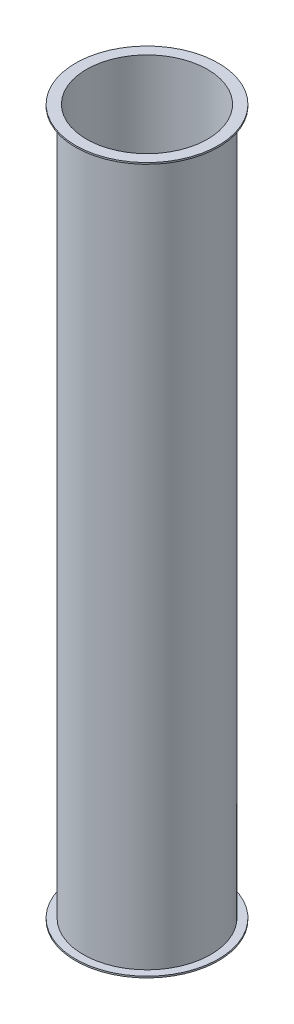
ISO-10303-21;
HEADER;
FILE_DESCRIPTION(('STEP AP214'),'2;1');
FILE_NAME('part.step','',(''),(''),'','','');
FILE_SCHEMA(('AUTOMOTIVE_DESIGN { 1 0 10303 214 1 1 1 1 }'));
ENDSEC;
DATA;
#1=APPLICATION_CONTEXT('core data for automotive mechanical design processes');
#2=APPLICATION_PROTOCOL_DEFINITION('international standard','automotive_design',2000,#1);
#3=PRODUCT_CONTEXT('',#1,'mechanical');
#4=PRODUCT('Part','Part','',(#3));
#5=PRODUCT_RELATED_PRODUCT_CATEGORY('part','',(#4));
#6=PRODUCT_DEFINITION_FORMATION('','',#4);
#7=PRODUCT_DEFINITION_CONTEXT('part definition',#1,'design');
#8=PRODUCT_DEFINITION('design','',#6,#7);
#9=PRODUCT_DEFINITION_SHAPE('','',#8);
#10=(LENGTH_UNIT() NAMED_UNIT(*) SI_UNIT(.MILLI.,.METRE.));
#11=(NAMED_UNIT(*) PLANE_ANGLE_UNIT() SI_UNIT($,.RADIAN.));
#12=(NAMED_UNIT(*) SI_UNIT($,.STERADIAN.) SOLID_ANGLE_UNIT());
#13=UNCERTAINTY_MEASURE_WITH_UNIT(LENGTH_MEASURE(1.E-05),#10,'distance_accuracy_value','');
#14=(GEOMETRIC_REPRESENTATION_CONTEXT(3) GLOBAL_UNCERTAINTY_ASSIGNED_CONTEXT((#13)) GLOBAL_UNIT_ASSIGNED_CONTEXT((#10,
#11,#12)) REPRESENTATION_CONTEXT('',''));
#15=CARTESIAN_POINT('',(0.,0.,0.));
#16=DIRECTION('',(0.,0.,1.));
#17=DIRECTION('',(1.,0.,0.));
#18=AXIS2_PLACEMENT_3D('',#15,#16,#17);
#19=CARTESIAN_POINT('',(0.,227.5,0.));
#20=DIRECTION('',(0.,-1.,0.));
#21=DIRECTION('',(0.,0.,-1.));
#22=AXIS2_PLACEMENT_3D('',#19,#20,#21);
#23=CYLINDRICAL_SURFACE('',#22,41.);
#24=CARTESIAN_POINT('',(0.,226.5,0.));
#25=DIRECTION('',(0.,1.,0.));
#26=DIRECTION('',(0.,0.,1.));
#27=AXIS2_PLACEMENT_3D('',#24,#25,#26);
#28=CIRCLE('',#27,41.);
#29=CARTESIAN_POINT('',(0.,226.5,-41.));
#30=VERTEX_POINT('',#29);
#31=EDGE_CURVE('E47',#30,#30,#28,.T.);
#32=CARTESIAN_POINT('',(0.,-226.5,0.));
#33=DIRECTION('',(0.,-1.,0.));
#34=DIRECTION('',(0.,0.,-1.));
#35=AXIS2_PLACEMENT_3D('',#32,#33,#34);
#36=CIRCLE('',#35,41.);
#37=CARTESIAN_POINT('',(0.,-226.5,-41.));
#38=VERTEX_POINT('',#37);
#39=EDGE_CURVE('E11',#38,#38,#36,.T.);
#40=CARTESIAN_POINT('',(0.,226.5,-41.));
#41=CARTESIAN_POINT('',(0.,221.78125,-41.));
#42=CARTESIAN_POINT('',(0.,217.0625,-41.));
#43=CARTESIAN_POINT('',(0.,207.625,-41.));
#44=CARTESIAN_POINT('',(0.,202.90625,-41.));
#45=CARTESIAN_POINT('',(0.,193.46875,-41.));
#46=CARTESIAN_POINT('',(0.,188.75,-41.));
#47=CARTESIAN_POINT('',(0.,179.3125,-41.));
#48=CARTESIAN_POINT('',(0.,174.59375,-41.));
#49=CARTESIAN_POINT('',(0.,165.15625,-41.));
#50=CARTESIAN_POINT('',(0.,160.4375,-41.));
#51=CARTESIAN_POINT('',(0.,151.,-41.));
#52=CARTESIAN_POINT('',(0.,146.28125,-41.));
#53=CARTESIAN_POINT('',(0.,136.84375,-41.));
#54=CARTESIAN_POINT('',(0.,132.125,-41.));
#55=CARTESIAN_POINT('',(0.,122.6875,-41.));
#56=CARTESIAN_POINT('',(0.,117.96875,-41.));
#57=CARTESIAN_POINT('',(0.,108.53125,-41.));
#58=CARTESIAN_POINT('',(0.,103.8125,-41.));
#59=CARTESIAN_POINT('',(0.,94.375,-41.));
#60=CARTESIAN_POINT('',(0.,89.65625,-41.));
#61=CARTESIAN_POINT('',(0.,80.21875,-41.));
#62=CARTESIAN_POINT('',(0.,75.5,-41.));
#63=CARTESIAN_POINT('',(0.,66.0625,-41.));
#64=CARTESIAN_POINT('',(0.,61.34375,-41.));
#65=CARTESIAN_POINT('',(0.,51.90625,-41.));
#66=CARTESIAN_POINT('',(0.,47.1875,-41.));
#67=CARTESIAN_POINT('',(0.,37.75,-41.));
#68=CARTESIAN_POINT('',(0.,33.03125,-41.));
#69=CARTESIAN_POINT('',(0.,23.59375,-41.));
#70=CARTESIAN_POINT('',(0.,18.875,-41.));
#71=CARTESIAN_POINT('',(0.,9.43749999999999,-41.));
#72=CARTESIAN_POINT('',(0.,4.71874999999999,-41.));
#73=CARTESIAN_POINT('',(0.,-4.71875000000001,-41.));
#74=CARTESIAN_POINT('',(0.,-9.43750000000002,-41.));
#75=CARTESIAN_POINT('',(0.,-18.875,-41.));
#76=CARTESIAN_POINT('',(0.,-23.59375,-41.));
#77=CARTESIAN_POINT('',(0.,-33.03125,-41.));
#78=CARTESIAN_POINT('',(0.,-37.75,-41.));
#79=CARTESIAN_POINT('',(0.,-47.1875,-41.));
#80=CARTESIAN_POINT('',(0.,-51.90625,-41.));
#81=CARTESIAN_POINT('',(0.,-61.34375,-41.));
#82=CARTESIAN_POINT('',(0.,-66.0625,-41.));
#83=CARTESIAN_POINT('',(0.,-75.5,-41.));
#84=CARTESIAN_POINT('',(0.,-80.21875,-41.));
#85=CARTESIAN_POINT('',(0.,-89.65625,-41.));
#86=CARTESIAN_POINT('',(0.,-94.375,-41.));
#87=CARTESIAN_POINT('',(0.,-103.8125,-41.));
#88=CARTESIAN_POINT('',(0.,-108.53125,-41.));
#89=CARTESIAN_POINT('',(0.,-117.96875,-41.));
#90=CARTESIAN_POINT('',(0.,-122.6875,-41.));
#91=CARTESIAN_POINT('',(0.,-132.125,-41.));
#92=CARTESIAN_POINT('',(0.,-136.84375,-41.));
#93=CARTESIAN_POINT('',(0.,-146.28125,-41.));
#94=CARTESIAN_POINT('',(0.,-151.,-41.));
#95=CARTESIAN_POINT('',(0.,-160.4375,-41.));
#96=CARTESIAN_POINT('',(0.,-165.15625,-41.));
#97=CARTESIAN_POINT('',(0.,-174.59375,-41.));
#98=CARTESIAN_POINT('',(0.,-179.3125,-41.));
#99=CARTESIAN_POINT('',(0.,-188.75,-41.));
#100=CARTESIAN_POINT('',(0.,-193.46875,-41.));
#101=CARTESIAN_POINT('',(0.,-202.90625,-41.));
#102=CARTESIAN_POINT('',(0.,-207.625,-41.));
#103=CARTESIAN_POINT('',(0.,-217.0625,-41.));
#104=CARTESIAN_POINT('',(0.,-221.78125,-41.));
#105=CARTESIAN_POINT('',(0.,-226.5,-41.));
#106=B_SPLINE_CURVE_WITH_KNOTS('',3,(#40,#41,#42,#43,#44,#45,#46,#47,#48,#49,#50,#51,#52,#53,
#54,#55,#56,#57,#58,#59,#60,#61,#62,#63,#64,#65,#66,#67,#68,#69,#70,#71,#72,#73,#74,#75,#76,#77,
#78,#79,#80,#81,#82,#83,#84,#85,#86,#87,#88,#89,#90,#91,#92,#93,#94,#95,#96,#97,#98,#99,#100,
#101,#102,#103,#104,#105),.UNSPECIFIED.,.F.,.F.,(4,2,2,2,2,2,2,2,2,2,2,2,2,2,2,2,2,2,2,2,2,2,2,
2,2,2,2,2,2,2,2,2,4),(0.,14.15625,28.3125,42.46875,56.625,70.78125,84.9375,99.09375,113.25,
127.40625,141.5625,155.71875,169.875,184.03125,198.1875,212.34375,226.5,240.65625,254.8125,
268.96875,283.125,297.28125,311.4375,325.59375,339.75,353.90625,368.0625,382.21875,396.375,
410.53125,424.6875,438.84375,453.),.UNSPECIFIED.);
#107=EDGE_CURVE('BSEAM41',#30,#38,#106,.T.);
#108=ORIENTED_EDGE('',*,*,#31,.F.);
#109=ORIENTED_EDGE('',*,*,#39,.F.);
#110=ORIENTED_EDGE('',*,*,#107,.T.);
#111=ORIENTED_EDGE('',*,*,#107,.F.);
#112=EDGE_LOOP('',(#108,#110,#109,#111));
#113=FACE_BOUND('',#112,.T.);
#114=ADVANCED_FACE('F41',(#113),#23,.T.);
#115=CARTESIAN_POINT('',(0.,227.5,0.));
#116=DIRECTION('',(0.,1.,0.));
#117=DIRECTION('',(0.,0.,1.));
#118=AXIS2_PLACEMENT_3D('',#115,#116,#117);
#119=PLANE('',#118);
#120=CARTESIAN_POINT('',(0.,227.5,0.));
#121=DIRECTION('',(0.,1.,0.));
#122=DIRECTION('',(0.,0.,1.));
#123=AXIS2_PLACEMENT_3D('',#120,#121,#122);
#124=CIRCLE('',#123,39.);
#125=CARTESIAN_POINT('',(0.,227.5,-39.));
#126=VERTEX_POINT('',#125);
#127=EDGE_CURVE('E51',#126,#126,#124,.T.);
#128=ORIENTED_EDGE('',*,*,#127,.F.);
#129=EDGE_LOOP('',(#128));
#130=FACE_BOUND('',#129,.T.);
#131=CARTESIAN_POINT('',(0.,227.5,0.));
#132=DIRECTION('',(0.,1.,0.));
#133=DIRECTION('',(0.,0.,1.));
#134=AXIS2_PLACEMENT_3D('',#131,#132,#133);
#135=CIRCLE('',#134,46.);
#136=CARTESIAN_POINT('',(0.,227.5,46.));
#137=VERTEX_POINT('',#136);
#138=EDGE_CURVE('E61',#137,#137,#135,.T.);
#139=ORIENTED_EDGE('',*,*,#138,.T.);
#140=EDGE_LOOP('',(#139));
#141=FACE_BOUND('',#140,.T.);
#142=ADVANCED_FACE('F85',(#130,#141),#119,.T.);
#143=CARTESIAN_POINT('',(0.,-227.5,0.));
#144=DIRECTION('',(0.,1.,0.));
#145=DIRECTION('',(0.,0.,1.));
#146=AXIS2_PLACEMENT_3D('',#143,#144,#145);
#147=PLANE('',#146);
#148=CARTESIAN_POINT('',(0.,-227.5,0.));
#149=DIRECTION('',(0.,1.,0.));
#150=DIRECTION('',(0.,0.,1.));
#151=AXIS2_PLACEMENT_3D('',#148,#149,#150);
#152=CIRCLE('',#151,39.);
#153=CARTESIAN_POINT('',(0.,-227.5,-39.));
#154=VERTEX_POINT('',#153);
#155=EDGE_CURVE('E55',#154,#154,#152,.T.);
#156=ORIENTED_EDGE('',*,*,#155,.T.);
#157=EDGE_LOOP('',(#156));
#158=FACE_BOUND('',#157,.T.);
#159=CARTESIAN_POINT('',(0.,-227.5,0.));
#160=DIRECTION('',(0.,-1.,0.));
#161=DIRECTION('',(0.,0.,-1.));
#162=AXIS2_PLACEMENT_3D('',#159,#160,#161);
#163=CIRCLE('',#162,46.);
#164=CARTESIAN_POINT('',(0.,-227.5,-46.));
#165=VERTEX_POINT('',#164);
#166=EDGE_CURVE('E67',#165,#165,#163,.T.);
#167=ORIENTED_EDGE('',*,*,#166,.T.);
#168=EDGE_LOOP('',(#167));
#169=FACE_BOUND('',#168,.T.);
#170=ADVANCED_FACE('F90',(#158,#169),#147,.F.);
#171=CARTESIAN_POINT('',(0.,227.5,0.));
#172=DIRECTION('',(0.,-1.,0.));
#173=DIRECTION('',(0.,0.,-1.));
#174=AXIS2_PLACEMENT_3D('',#171,#172,#173);
#175=CYLINDRICAL_SURFACE('',#174,39.);
#176=CARTESIAN_POINT('',(0.,227.5,-39.));
#177=CARTESIAN_POINT('',(0.,222.760416666667,-39.));
#178=CARTESIAN_POINT('',(0.,218.020833333333,-39.));
#179=CARTESIAN_POINT('',(0.,208.541666666667,-39.));
#180=CARTESIAN_POINT('',(0.,203.802083333333,-39.));
#181=CARTESIAN_POINT('',(0.,194.322916666667,-39.));
#182=CARTESIAN_POINT('',(0.,189.583333333333,-39.));
#183=CARTESIAN_POINT('',(0.,180.104166666667,-39.));
#184=CARTESIAN_POINT('',(0.,175.364583333333,-39.));
#185=CARTESIAN_POINT('',(0.,165.885416666667,-39.));
#186=CARTESIAN_POINT('',(0.,161.145833333333,-39.));
#187=CARTESIAN_POINT('',(0.,151.666666666667,-39.));
#188=CARTESIAN_POINT('',(0.,146.927083333333,-39.));
#189=CARTESIAN_POINT('',(0.,137.447916666667,-39.));
#190=CARTESIAN_POINT('',(0.,132.708333333333,-39.));
#191=CARTESIAN_POINT('',(0.,123.229166666667,-39.));
#192=CARTESIAN_POINT('',(0.,118.489583333333,-39.));
#193=CARTESIAN_POINT('',(0.,109.010416666667,-39.));
#194=CARTESIAN_POINT('',(0.,104.270833333333,-39.));
#195=CARTESIAN_POINT('',(0.,94.7916666666667,-39.));
#196=CARTESIAN_POINT('',(0.,90.0520833333334,-39.));
#197=CARTESIAN_POINT('',(0.,80.5729166666667,-39.));
#198=CARTESIAN_POINT('',(0.,75.8333333333333,-39.));
#199=CARTESIAN_POINT('',(0.,66.3541666666667,-39.));
#200=CARTESIAN_POINT('',(0.,61.6145833333333,-39.));
#201=CARTESIAN_POINT('',(0.,52.1354166666667,-39.));
#202=CARTESIAN_POINT('',(0.,47.3958333333333,-39.));
#203=CARTESIAN_POINT('',(0.,37.9166666666667,-39.));
#204=CARTESIAN_POINT('',(0.,33.1770833333333,-39.));
#205=CARTESIAN_POINT('',(0.,23.6979166666667,-39.));
#206=CARTESIAN_POINT('',(0.,18.9583333333333,-39.));
#207=CARTESIAN_POINT('',(0.,9.47916666666667,-39.));
#208=CARTESIAN_POINT('',(0.,4.73958333333333,-39.));
#209=CARTESIAN_POINT('',(0.,-4.73958333333333,-39.));
#210=CARTESIAN_POINT('',(0.,-9.47916666666667,-39.));
#211=CARTESIAN_POINT('',(0.,-18.9583333333333,-39.));
#212=CARTESIAN_POINT('',(0.,-23.6979166666667,-39.));
#213=CARTESIAN_POINT('',(0.,-33.1770833333333,-39.));
#214=CARTESIAN_POINT('',(0.,-37.9166666666667,-39.));
#215=CARTESIAN_POINT('',(0.,-47.3958333333333,-39.));
#216=CARTESIAN_POINT('',(0.,-52.1354166666667,-39.));
#217=CARTESIAN_POINT('',(0.,-61.6145833333333,-39.));
#218=CARTESIAN_POINT('',(0.,-66.3541666666666,-39.));
#219=CARTESIAN_POINT('',(0.,-75.8333333333333,-39.));
#220=CARTESIAN_POINT('',(0.,-80.5729166666666,-39.));
#221=CARTESIAN_POINT('',(0.,-90.0520833333333,-39.));
#222=CARTESIAN_POINT('',(0.,-94.7916666666666,-39.));
#223=CARTESIAN_POINT('',(0.,-104.270833333333,-39.));
#224=CARTESIAN_POINT('',(0.,-109.010416666667,-39.));
#225=CARTESIAN_POINT('',(0.,-118.489583333333,-39.));
#226=CARTESIAN_POINT('',(0.,-123.229166666667,-39.));
#227=CARTESIAN_POINT('',(0.,-132.708333333333,-39.));
#228=CARTESIAN_POINT('',(0.,-137.447916666667,-39.));
#229=CARTESIAN_POINT('',(0.,-146.927083333333,-39.));
#230=CARTESIAN_POINT('',(0.,-151.666666666667,-39.));
#231=CARTESIAN_POINT('',(0.,-161.145833333333,-39.));
#232=CARTESIAN_POINT('',(0.,-165.885416666667,-39.));
#233=CARTESIAN_POINT('',(0.,-175.364583333333,-39.));
#234=CARTESIAN_POINT('',(0.,-180.104166666667,-39.));
#235=CARTESIAN_POINT('',(0.,-189.583333333333,-39.));
#236=CARTESIAN_POINT('',(0.,-194.322916666667,-39.));
#237=CARTESIAN_POINT('',(0.,-203.802083333333,-39.));
#238=CARTESIAN_POINT('',(0.,-208.541666666667,-39.));
#239=CARTESIAN_POINT('',(0.,-218.020833333333,-39.));
#240=CARTESIAN_POINT('',(0.,-222.760416666667,-39.));
#241=CARTESIAN_POINT('',(0.,-227.5,-39.));
#242=B_SPLINE_CURVE_WITH_KNOTS('',3,(#176,#177,#178,#179,#180,#181,#182,#183,#184,#185,#186,
#187,#188,#189,#190,#191,#192,#193,#194,#195,#196,#197,#198,#199,#200,#201,#202,#203,#204,#205,
#206,#207,#208,#209,#210,#211,#212,#213,#214,#215,#216,#217,#218,#219,#220,#221,#222,#223,#224,
#225,#226,#227,#228,#229,#230,#231,#232,#233,#234,#235,#236,#237,#238,#239,#240,#241),
.UNSPECIFIED.,.F.,.F.,(4,2,2,2,2,2,2,2,2,2,2,2,2,2,2,2,2,2,2,2,2,2,2,2,2,2,2,2,2,2,2,2,4),(0.,
14.21875,28.4375,42.65625,56.875,71.09375,85.3125,99.53125,113.75,127.96875,142.1875,156.40625,
170.625,184.84375,199.0625,213.28125,227.5,241.71875,255.9375,270.15625,284.375,298.59375,
312.8125,327.03125,341.25,355.46875,369.6875,383.90625,398.125,412.34375,426.5625,440.78125,
455.),.UNSPECIFIED.);
#243=EDGE_CURVE('BSEAM97',#126,#154,#242,.T.);
#244=ORIENTED_EDGE('',*,*,#127,.T.);
#245=ORIENTED_EDGE('',*,*,#155,.F.);
#246=ORIENTED_EDGE('',*,*,#243,.T.);
#247=ORIENTED_EDGE('',*,*,#243,.F.);
#248=EDGE_LOOP('',(#244,#246,#245,#247));
#249=FACE_BOUND('',#248,.T.);
#250=ADVANCED_FACE('F97',(#249),#175,.F.);
#251=CARTESIAN_POINT('',(0.,226.5,0.));
#252=DIRECTION('',(0.,1.,0.));
#253=DIRECTION('',(0.,0.,1.));
#254=AXIS2_PLACEMENT_3D('',#251,#252,#253);
#255=CYLINDRICAL_SURFACE('',#254,46.);
#256=CARTESIAN_POINT('',(0.,226.5,0.));
#257=DIRECTION('',(0.,1.,0.));
#258=DIRECTION('',(0.,0.,1.));
#259=AXIS2_PLACEMENT_3D('',#256,#257,#258);
#260=CIRCLE('',#259,46.);
#261=CARTESIAN_POINT('',(0.,226.5,46.));
#262=VERTEX_POINT('',#261);
#263=EDGE_CURVE('E59',#262,#262,#260,.T.);
#264=ORIENTED_EDGE('',*,*,#263,.T.);
#265=EDGE_LOOP('',(#264));
#266=FACE_BOUND('',#265,.T.);
#267=ORIENTED_EDGE('',*,*,#138,.F.);
#268=EDGE_LOOP('',(#267));
#269=FACE_BOUND('',#268,.T.);
#270=ADVANCED_FACE('F104',(#266,#269),#255,.T.);
#271=CARTESIAN_POINT('',(0.,226.5,0.));
#272=DIRECTION('',(0.,1.,0.));
#273=DIRECTION('',(0.,0.,1.));
#274=AXIS2_PLACEMENT_3D('',#271,#272,#273);
#275=PLANE('',#274);
#276=ORIENTED_EDGE('',*,*,#31,.T.);
#277=EDGE_LOOP('',(#276));
#278=FACE_BOUND('',#277,.T.);
#279=ORIENTED_EDGE('',*,*,#263,.F.);
#280=EDGE_LOOP('',(#279));
#281=FACE_BOUND('',#280,.T.);
#282=ADVANCED_FACE('F82',(#278,#281),#275,.F.);
#283=CARTESIAN_POINT('',(0.,-226.5,0.));
#284=DIRECTION('',(0.,-1.,0.));
#285=DIRECTION('',(0.,0.,-1.));
#286=AXIS2_PLACEMENT_3D('',#283,#284,#285);
#287=CYLINDRICAL_SURFACE('',#286,46.);
#288=CARTESIAN_POINT('',(0.,-226.5,0.));
#289=DIRECTION('',(0.,-1.,0.));
#290=DIRECTION('',(0.,0.,-1.));
#291=AXIS2_PLACEMENT_3D('',#288,#289,#290);
#292=CIRCLE('',#291,46.);
#293=CARTESIAN_POINT('',(0.,-226.5,-46.));
#294=VERTEX_POINT('',#293);
#295=EDGE_CURVE('E64',#294,#294,#292,.T.);
#296=ORIENTED_EDGE('',*,*,#295,.T.);
#297=EDGE_LOOP('',(#296));
#298=FACE_BOUND('',#297,.T.);
#299=ORIENTED_EDGE('',*,*,#166,.F.);
#300=EDGE_LOOP('',(#299));
#301=FACE_BOUND('',#300,.T.);
#302=ADVANCED_FACE('F73',(#298,#301),#287,.T.);
#303=CARTESIAN_POINT('',(0.,-226.5,0.));
#304=DIRECTION('',(0.,-1.,0.));
#305=DIRECTION('',(0.,0.,-1.));
#306=AXIS2_PLACEMENT_3D('',#303,#304,#305);
#307=PLANE('',#306);
#308=ORIENTED_EDGE('',*,*,#39,.T.);
#309=EDGE_LOOP('',(#308));
#310=FACE_BOUND('',#309,.T.);
#311=ORIENTED_EDGE('',*,*,#295,.F.);
#312=EDGE_LOOP('',(#311));
#313=FACE_BOUND('',#312,.T.);
#314=ADVANCED_FACE('F76',(#310,#313),#307,.F.);
#315=CLOSED_SHELL('',(#114,#142,#170,#250,#270,#282,#302,#314));
#316=MANIFOLD_SOLID_BREP('B2',#315);
#317=ADVANCED_BREP_SHAPE_REPRESENTATION('',(#18,#316),#14);
#318=SHAPE_DEFINITION_REPRESENTATION(#9,#317);
ENDSEC;
END-ISO-10303-21;
